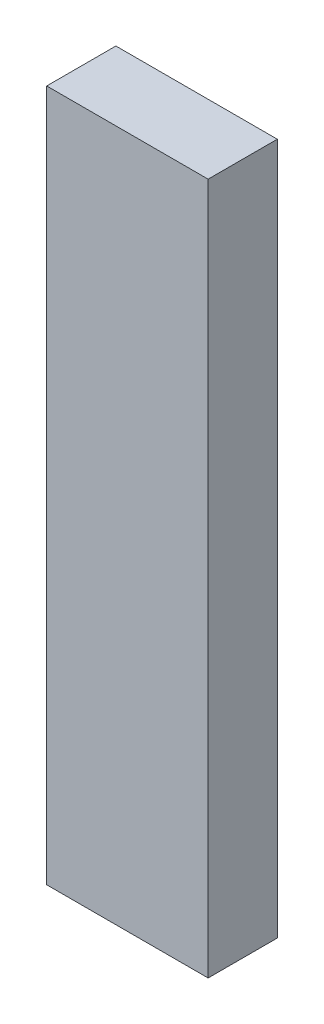
ISO-10303-21;
HEADER;
FILE_DESCRIPTION(('STEP AP214'),'2;1');
FILE_NAME('part.step','',(''),(''),'','','');
FILE_SCHEMA(('AUTOMOTIVE_DESIGN { 1 0 10303 214 1 1 1 1 }'));
ENDSEC;
DATA;
#1=APPLICATION_CONTEXT('core data for automotive mechanical design processes');
#2=APPLICATION_PROTOCOL_DEFINITION('international standard','automotive_design',2000,#1);
#3=PRODUCT_CONTEXT('',#1,'mechanical');
#4=PRODUCT('Part','Part','',(#3));
#5=PRODUCT_RELATED_PRODUCT_CATEGORY('part','',(#4));
#6=PRODUCT_DEFINITION_FORMATION('','',#4);
#7=PRODUCT_DEFINITION_CONTEXT('part definition',#1,'design');
#8=PRODUCT_DEFINITION('design','',#6,#7);
#9=PRODUCT_DEFINITION_SHAPE('','',#8);
#10=(LENGTH_UNIT() NAMED_UNIT(*) SI_UNIT(.MILLI.,.METRE.));
#11=(NAMED_UNIT(*) PLANE_ANGLE_UNIT() SI_UNIT($,.RADIAN.));
#12=(NAMED_UNIT(*) SI_UNIT($,.STERADIAN.) SOLID_ANGLE_UNIT());
#13=UNCERTAINTY_MEASURE_WITH_UNIT(LENGTH_MEASURE(1.E-05),#10,'distance_accuracy_value','');
#14=(GEOMETRIC_REPRESENTATION_CONTEXT(3) GLOBAL_UNCERTAINTY_ASSIGNED_CONTEXT((#13)) GLOBAL_UNIT_ASSIGNED_CONTEXT((#10,
#11,#12)) REPRESENTATION_CONTEXT('',''));
#15=CARTESIAN_POINT('',(0.,0.,0.));
#16=DIRECTION('',(0.,0.,1.));
#17=DIRECTION('',(1.,0.,0.));
#18=AXIS2_PLACEMENT_3D('',#15,#16,#17);
#19=CARTESIAN_POINT('',(3.5,15.,3.));
#20=DIRECTION('',(-1.,0.,0.));
#21=DIRECTION('',(0.,-1.,0.));
#22=AXIS2_PLACEMENT_3D('',#19,#20,#21);
#23=PLANE('',#22);
#24=DIRECTION('',(0.,1.,0.));
#25=VECTOR('',#24,1.);
#26=CARTESIAN_POINT('',(3.5,15.,0.));
#27=LINE('',#26,#25);
#28=CARTESIAN_POINT('',(3.5,-15.,0.));
#29=VERTEX_POINT('',#28);
#30=CARTESIAN_POINT('',(3.5,15.,0.));
#31=VERTEX_POINT('',#30);
#32=EDGE_CURVE('E96',#29,#31,#27,.T.);
#33=ORIENTED_EDGE('',*,*,#32,.T.);
#34=DIRECTION('',(0.,0.,-1.));
#35=VECTOR('',#34,1.);
#36=CARTESIAN_POINT('',(3.5,15.,3.));
#37=LINE('',#36,#35);
#38=CARTESIAN_POINT('',(3.5,15.,3.));
#39=VERTEX_POINT('',#38);
#40=EDGE_CURVE('E11',#39,#31,#37,.T.);
#41=ORIENTED_EDGE('',*,*,#40,.F.);
#42=DIRECTION('',(0.,1.,0.));
#43=VECTOR('',#42,1.);
#44=CARTESIAN_POINT('',(3.5,15.,3.));
#45=LINE('',#44,#43);
#46=CARTESIAN_POINT('',(3.5,-15.,3.));
#47=VERTEX_POINT('',#46);
#48=EDGE_CURVE('E84',#47,#39,#45,.T.);
#49=ORIENTED_EDGE('',*,*,#48,.F.);
#50=DIRECTION('',(0.,0.,-1.));
#51=VECTOR('',#50,1.);
#52=CARTESIAN_POINT('',(3.5,-15.,3.));
#53=LINE('',#52,#51);
#54=EDGE_CURVE('E92',#47,#29,#53,.T.);
#55=ORIENTED_EDGE('',*,*,#54,.T.);
#56=EDGE_LOOP('',(#33,#41,#49,#55));
#57=FACE_BOUND('',#56,.T.);
#58=ADVANCED_FACE('F33',(#57),#23,.F.);
#59=CARTESIAN_POINT('',(-3.5,15.,3.));
#60=DIRECTION('',(0.,-1.,0.));
#61=DIRECTION('',(0.,0.,-1.));
#62=AXIS2_PLACEMENT_3D('',#59,#60,#61);
#63=PLANE('',#62);
#64=DIRECTION('',(-1.,0.,0.));
#65=VECTOR('',#64,1.);
#66=CARTESIAN_POINT('',(-3.5,15.,0.));
#67=LINE('',#66,#65);
#68=CARTESIAN_POINT('',(-3.5,15.,0.));
#69=VERTEX_POINT('',#68);
#70=EDGE_CURVE('E88',#31,#69,#67,.T.);
#71=ORIENTED_EDGE('',*,*,#70,.T.);
#72=DIRECTION('',(0.,0.,-1.));
#73=VECTOR('',#72,1.);
#74=CARTESIAN_POINT('',(-3.5,15.,3.));
#75=LINE('',#74,#73);
#76=CARTESIAN_POINT('',(-3.5,15.,3.));
#77=VERTEX_POINT('',#76);
#78=EDGE_CURVE('E41',#77,#69,#75,.T.);
#79=ORIENTED_EDGE('',*,*,#78,.F.);
#80=DIRECTION('',(-1.,0.,0.));
#81=VECTOR('',#80,1.);
#82=CARTESIAN_POINT('',(-3.5,15.,3.));
#83=LINE('',#82,#81);
#84=EDGE_CURVE('E79',#39,#77,#83,.T.);
#85=ORIENTED_EDGE('',*,*,#84,.F.);
#86=ORIENTED_EDGE('',*,*,#40,.T.);
#87=EDGE_LOOP('',(#71,#79,#85,#86));
#88=FACE_BOUND('',#87,.T.);
#89=ADVANCED_FACE('F87',(#88),#63,.F.);
#90=CARTESIAN_POINT('',(-3.5,15.,3.));
#91=DIRECTION('',(1.,0.,0.));
#92=DIRECTION('',(0.,1.,0.));
#93=AXIS2_PLACEMENT_3D('',#90,#91,#92);
#94=PLANE('',#93);
#95=DIRECTION('',(0.,-1.,0.));
#96=VECTOR('',#95,1.);
#97=CARTESIAN_POINT('',(-3.5,15.,0.));
#98=LINE('',#97,#96);
#99=CARTESIAN_POINT('',(-3.5,-15.,0.));
#100=VERTEX_POINT('',#99);
#101=EDGE_CURVE('E66',#69,#100,#98,.T.);
#102=ORIENTED_EDGE('',*,*,#101,.T.);
#103=DIRECTION('',(0.,0.,-1.));
#104=VECTOR('',#103,1.);
#105=CARTESIAN_POINT('',(-3.5,-15.,3.));
#106=LINE('',#105,#104);
#107=CARTESIAN_POINT('',(-3.5,-15.,3.));
#108=VERTEX_POINT('',#107);
#109=EDGE_CURVE('E89',#108,#100,#106,.T.);
#110=ORIENTED_EDGE('',*,*,#109,.F.);
#111=DIRECTION('',(0.,-1.,0.));
#112=VECTOR('',#111,1.);
#113=CARTESIAN_POINT('',(-3.5,15.,3.));
#114=LINE('',#113,#112);
#115=EDGE_CURVE('E82',#77,#108,#114,.T.);
#116=ORIENTED_EDGE('',*,*,#115,.F.);
#117=ORIENTED_EDGE('',*,*,#78,.T.);
#118=EDGE_LOOP('',(#102,#110,#116,#117));
#119=FACE_BOUND('',#118,.T.);
#120=ADVANCED_FACE('F90',(#119),#94,.F.);
#121=CARTESIAN_POINT('',(-3.5,-15.,3.));
#122=DIRECTION('',(0.,1.,0.));
#123=DIRECTION('',(0.,0.,1.));
#124=AXIS2_PLACEMENT_3D('',#121,#122,#123);
#125=PLANE('',#124);
#126=DIRECTION('',(1.,0.,0.));
#127=VECTOR('',#126,1.);
#128=CARTESIAN_POINT('',(-3.5,-15.,0.));
#129=LINE('',#128,#127);
#130=EDGE_CURVE('E72',#100,#29,#129,.T.);
#131=ORIENTED_EDGE('',*,*,#130,.T.);
#132=ORIENTED_EDGE('',*,*,#54,.F.);
#133=DIRECTION('',(1.,0.,0.));
#134=VECTOR('',#133,1.);
#135=CARTESIAN_POINT('',(-3.5,-15.,3.));
#136=LINE('',#135,#134);
#137=EDGE_CURVE('E49',#108,#47,#136,.T.);
#138=ORIENTED_EDGE('',*,*,#137,.F.);
#139=ORIENTED_EDGE('',*,*,#109,.T.);
#140=EDGE_LOOP('',(#131,#132,#138,#139));
#141=FACE_BOUND('',#140,.T.);
#142=ADVANCED_FACE('F103',(#141),#125,.F.);
#143=CARTESIAN_POINT('',(0.,0.,3.));
#144=DIRECTION('',(0.,0.,1.));
#145=DIRECTION('',(1.,0.,0.));
#146=AXIS2_PLACEMENT_3D('',#143,#144,#145);
#147=PLANE('',#146);
#148=ORIENTED_EDGE('',*,*,#48,.T.);
#149=ORIENTED_EDGE('',*,*,#84,.T.);
#150=ORIENTED_EDGE('',*,*,#115,.T.);
#151=ORIENTED_EDGE('',*,*,#137,.T.);
#152=EDGE_LOOP('',(#148,#149,#150,#151));
#153=FACE_BOUND('',#152,.T.);
#154=ADVANCED_FACE('F80',(#153),#147,.T.);
#155=CARTESIAN_POINT('',(0.,0.,0.));
#156=DIRECTION('',(0.,0.,1.));
#157=DIRECTION('',(1.,0.,0.));
#158=AXIS2_PLACEMENT_3D('',#155,#156,#157);
#159=PLANE('',#158);
#160=ORIENTED_EDGE('',*,*,#32,.F.);
#161=ORIENTED_EDGE('',*,*,#130,.F.);
#162=ORIENTED_EDGE('',*,*,#101,.F.);
#163=ORIENTED_EDGE('',*,*,#70,.F.);
#164=EDGE_LOOP('',(#160,#161,#162,#163));
#165=FACE_BOUND('',#164,.T.);
#166=ADVANCED_FACE('F106',(#165),#159,.F.);
#167=CLOSED_SHELL('',(#58,#89,#120,#142,#154,#166));
#168=MANIFOLD_SOLID_BREP('B2',#167);
#169=ADVANCED_BREP_SHAPE_REPRESENTATION('',(#18,#168),#14);
#170=SHAPE_DEFINITION_REPRESENTATION(#9,#169);
ENDSEC;
END-ISO-10303-21;
